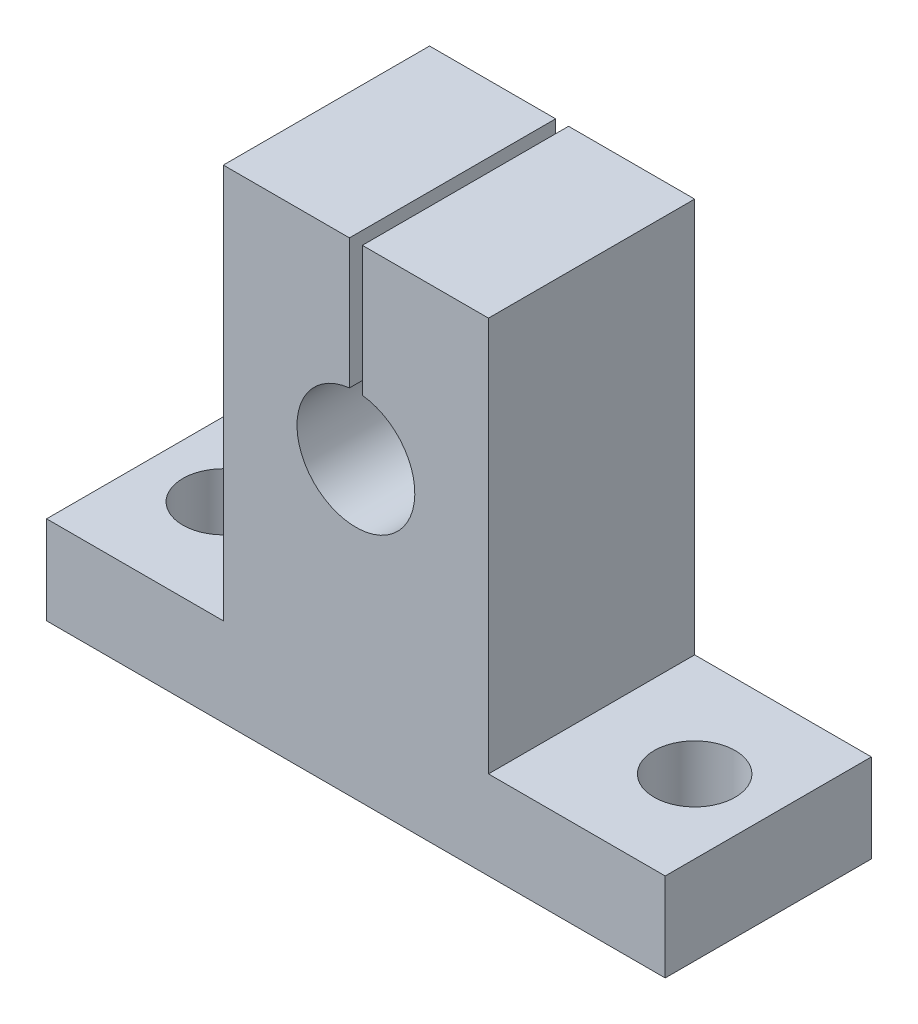
ISO-10303-21;
HEADER;
FILE_DESCRIPTION(('STEP AP214'),'2;1');
FILE_NAME('part.step','',(''),(''),'','','');
FILE_SCHEMA(('AUTOMOTIVE_DESIGN { 1 0 10303 214 1 1 1 1 }'));
ENDSEC;
DATA;
#1=APPLICATION_CONTEXT('core data for automotive mechanical design processes');
#2=APPLICATION_PROTOCOL_DEFINITION('international standard','automotive_design',2000,#1);
#3=PRODUCT_CONTEXT('',#1,'mechanical');
#4=PRODUCT('Part','Part','',(#3));
#5=PRODUCT_RELATED_PRODUCT_CATEGORY('part','',(#4));
#6=PRODUCT_DEFINITION_FORMATION('','',#4);
#7=PRODUCT_DEFINITION_CONTEXT('part definition',#1,'design');
#8=PRODUCT_DEFINITION('design','',#6,#7);
#9=PRODUCT_DEFINITION_SHAPE('','',#8);
#10=(LENGTH_UNIT() NAMED_UNIT(*) SI_UNIT(.MILLI.,.METRE.));
#11=(NAMED_UNIT(*) PLANE_ANGLE_UNIT() SI_UNIT($,.RADIAN.));
#12=(NAMED_UNIT(*) SI_UNIT($,.STERADIAN.) SOLID_ANGLE_UNIT());
#13=UNCERTAINTY_MEASURE_WITH_UNIT(LENGTH_MEASURE(1.E-05),#10,'distance_accuracy_value','');
#14=(GEOMETRIC_REPRESENTATION_CONTEXT(3) GLOBAL_UNCERTAINTY_ASSIGNED_CONTEXT((#13)) GLOBAL_UNIT_ASSIGNED_CONTEXT((#10,
#11,#12)) REPRESENTATION_CONTEXT('',''));
#15=CARTESIAN_POINT('',(0.,0.,0.));
#16=DIRECTION('',(0.,0.,1.));
#17=DIRECTION('',(1.,0.,0.));
#18=AXIS2_PLACEMENT_3D('',#15,#16,#17);
#19=CARTESIAN_POINT('',(21.,-14.,14.));
#20=DIRECTION('',(0.,-1.,0.));
#21=DIRECTION('',(1.,0.,0.));
#22=AXIS2_PLACEMENT_3D('',#19,#20,#21);
#23=PLANE('',#22);
#24=CARTESIAN_POINT('',(16.,-14.,7.));
#25=DIRECTION('',(0.,1.,0.));
#26=DIRECTION('',(0.,0.,1.));
#27=AXIS2_PLACEMENT_3D('',#24,#25,#26);
#28=CIRCLE('',#27,2.75);
#29=CARTESIAN_POINT('',(16.,-14.,9.75));
#30=VERTEX_POINT('',#29);
#31=EDGE_CURVE('E265',#30,#30,#28,.T.);
#32=ORIENTED_EDGE('',*,*,#31,.F.);
#33=EDGE_LOOP('',(#32));
#34=FACE_BOUND('',#33,.T.);
#35=DIRECTION('',(-1.,0.,0.));
#36=VECTOR('',#35,1.);
#37=CARTESIAN_POINT('',(21.,-14.,0.));
#38=LINE('',#37,#36);
#39=CARTESIAN_POINT('',(21.,-14.,0.));
#40=VERTEX_POINT('',#39);
#41=CARTESIAN_POINT('',(8.99999999999996,-14.,0.));
#42=VERTEX_POINT('',#41);
#43=EDGE_CURVE('E156',#40,#42,#38,.T.);
#44=ORIENTED_EDGE('',*,*,#43,.T.);
#45=DIRECTION('',(0.,0.,-1.));
#46=VECTOR('',#45,1.);
#47=CARTESIAN_POINT('',(8.99999999999996,-14.,14.));
#48=LINE('',#47,#46);
#49=CARTESIAN_POINT('',(8.99999999999996,-14.,14.));
#50=VERTEX_POINT('',#49);
#51=EDGE_CURVE('E11',#50,#42,#48,.T.);
#52=ORIENTED_EDGE('',*,*,#51,.F.);
#53=DIRECTION('',(-1.,0.,0.));
#54=VECTOR('',#53,1.);
#55=CARTESIAN_POINT('',(21.,-14.,14.));
#56=LINE('',#55,#54);
#57=CARTESIAN_POINT('',(21.,-14.,14.));
#58=VERTEX_POINT('',#57);
#59=EDGE_CURVE('E179',#58,#50,#56,.T.);
#60=ORIENTED_EDGE('',*,*,#59,.F.);
#61=DIRECTION('',(0.,0.,-1.));
#62=VECTOR('',#61,1.);
#63=CARTESIAN_POINT('',(21.,-14.,14.));
#64=LINE('',#63,#62);
#65=EDGE_CURVE('E152',#58,#40,#64,.T.);
#66=ORIENTED_EDGE('',*,*,#65,.T.);
#67=EDGE_LOOP('',(#44,#52,#60,#66));
#68=FACE_BOUND('',#67,.T.);
#69=ADVANCED_FACE('F36',(#34,#68),#23,.F.);
#70=CARTESIAN_POINT('',(8.99999999999996,-14.,14.));
#71=DIRECTION('',(-1.,0.,0.));
#72=DIRECTION('',(0.,-1.,0.));
#73=AXIS2_PLACEMENT_3D('',#70,#71,#72);
#74=PLANE('',#73);
#75=DIRECTION('',(0.,1.,0.));
#76=VECTOR('',#75,1.);
#77=CARTESIAN_POINT('',(8.99999999999996,-14.,0.));
#78=LINE('',#77,#76);
#79=CARTESIAN_POINT('',(9.,12.8,0.));
#80=VERTEX_POINT('',#79);
#81=EDGE_CURVE('E159',#42,#80,#78,.T.);
#82=ORIENTED_EDGE('',*,*,#81,.T.);
#83=DIRECTION('',(0.,0.,-1.));
#84=VECTOR('',#83,1.);
#85=CARTESIAN_POINT('',(9.,12.8,14.));
#86=LINE('',#85,#84);
#87=CARTESIAN_POINT('',(9.,12.8,14.));
#88=VERTEX_POINT('',#87);
#89=EDGE_CURVE('E44',#88,#80,#86,.T.);
#90=ORIENTED_EDGE('',*,*,#89,.F.);
#91=DIRECTION('',(0.,1.,0.));
#92=VECTOR('',#91,1.);
#93=CARTESIAN_POINT('',(8.99999999999996,-14.,14.));
#94=LINE('',#93,#92);
#95=EDGE_CURVE('E107',#50,#88,#94,.T.);
#96=ORIENTED_EDGE('',*,*,#95,.F.);
#97=ORIENTED_EDGE('',*,*,#51,.T.);
#98=EDGE_LOOP('',(#82,#90,#96,#97));
#99=FACE_BOUND('',#98,.T.);
#100=ADVANCED_FACE('F258',(#99),#74,.F.);
#101=CARTESIAN_POINT('',(0.438791816963508,12.8,14.));
#102=DIRECTION('',(0.,-1.,0.));
#103=DIRECTION('',(1.,0.,0.));
#104=AXIS2_PLACEMENT_3D('',#101,#102,#103);
#105=PLANE('',#104);
#106=DIRECTION('',(-1.,0.,0.));
#107=VECTOR('',#106,1.);
#108=CARTESIAN_POINT('',(0.438791816963508,12.8,0.));
#109=LINE('',#108,#107);
#110=CARTESIAN_POINT('',(0.438791816963508,12.8,0.));
#111=VERTEX_POINT('',#110);
#112=EDGE_CURVE('E162',#80,#111,#109,.T.);
#113=ORIENTED_EDGE('',*,*,#112,.T.);
#114=DIRECTION('',(0.,0.,-1.));
#115=VECTOR('',#114,1.);
#116=CARTESIAN_POINT('',(0.438791816963508,12.8,14.));
#117=LINE('',#116,#115);
#118=CARTESIAN_POINT('',(0.438791816963508,12.8,14.));
#119=VERTEX_POINT('',#118);
#120=EDGE_CURVE('E198',#119,#111,#117,.T.);
#121=ORIENTED_EDGE('',*,*,#120,.F.);
#122=DIRECTION('',(-1.,0.,0.));
#123=VECTOR('',#122,1.);
#124=CARTESIAN_POINT('',(0.438791816963508,12.8,14.));
#125=LINE('',#124,#123);
#126=EDGE_CURVE('E206',#88,#119,#125,.T.);
#127=ORIENTED_EDGE('',*,*,#126,.F.);
#128=ORIENTED_EDGE('',*,*,#89,.T.);
#129=EDGE_LOOP('',(#113,#121,#127,#128));
#130=FACE_BOUND('',#129,.T.);
#131=ADVANCED_FACE('F204',(#130),#105,.F.);
#132=CARTESIAN_POINT('',(0.438791816963508,12.8,14.));
#133=DIRECTION('',(1.,0.,0.));
#134=DIRECTION('',(0.,0.,-1.));
#135=AXIS2_PLACEMENT_3D('',#132,#133,#134);
#136=PLANE('',#135);
#137=DIRECTION('',(0.,-1.,0.));
#138=VECTOR('',#137,1.);
#139=CARTESIAN_POINT('',(0.438791816963508,12.8,0.));
#140=LINE('',#139,#138);
#141=CARTESIAN_POINT('',(0.438791816963509,3.97585987446312,0.));
#142=VERTEX_POINT('',#141);
#143=EDGE_CURVE('E164',#111,#142,#140,.T.);
#144=ORIENTED_EDGE('',*,*,#143,.T.);
#145=DIRECTION('',(0.,0.,-1.));
#146=VECTOR('',#145,1.);
#147=CARTESIAN_POINT('',(0.438791816963509,3.97585987446312,14.));
#148=LINE('',#147,#146);
#149=CARTESIAN_POINT('',(0.438791816963509,3.97585987446312,14.));
#150=VERTEX_POINT('',#149);
#151=EDGE_CURVE('E195',#150,#142,#148,.T.);
#152=ORIENTED_EDGE('',*,*,#151,.F.);
#153=DIRECTION('',(0.,-1.,0.));
#154=VECTOR('',#153,1.);
#155=CARTESIAN_POINT('',(0.438791816963508,12.8,14.));
#156=LINE('',#155,#154);
#157=EDGE_CURVE('E224',#119,#150,#156,.T.);
#158=ORIENTED_EDGE('',*,*,#157,.F.);
#159=ORIENTED_EDGE('',*,*,#120,.T.);
#160=EDGE_LOOP('',(#144,#152,#158,#159));
#161=FACE_BOUND('',#160,.T.);
#162=ADVANCED_FACE('F215',(#161),#136,.F.);
#163=CARTESIAN_POINT('',(0.,0.,14.));
#164=DIRECTION('',(0.,0.,-1.));
#165=DIRECTION('',(-1.,0.,0.));
#166=AXIS2_PLACEMENT_3D('',#163,#164,#165);
#167=CYLINDRICAL_SURFACE('',#166,4.);
#168=CARTESIAN_POINT('',(0.,0.,0.));
#169=DIRECTION('',(0.,0.,-1.));
#170=DIRECTION('',(1.,0.,0.));
#171=AXIS2_PLACEMENT_3D('',#168,#169,#170);
#172=CIRCLE('',#171,4.);
#173=CARTESIAN_POINT('',(-0.438791816963511,3.97585987446311,0.));
#174=VERTEX_POINT('',#173);
#175=EDGE_CURVE('E166',#142,#174,#172,.T.);
#176=ORIENTED_EDGE('',*,*,#175,.T.);
#177=DIRECTION('',(0.,0.,-1.));
#178=VECTOR('',#177,1.);
#179=CARTESIAN_POINT('',(-0.438791816963511,3.97585987446311,14.));
#180=LINE('',#179,#178);
#181=CARTESIAN_POINT('',(-0.438791816963511,3.97585987446311,14.));
#182=VERTEX_POINT('',#181);
#183=EDGE_CURVE('E192',#182,#174,#180,.T.);
#184=ORIENTED_EDGE('',*,*,#183,.F.);
#185=CARTESIAN_POINT('',(0.,0.,14.));
#186=DIRECTION('',(0.,0.,-1.));
#187=DIRECTION('',(1.,0.,0.));
#188=AXIS2_PLACEMENT_3D('',#185,#186,#187);
#189=CIRCLE('',#188,4.);
#190=EDGE_CURVE('E221',#150,#182,#189,.T.);
#191=ORIENTED_EDGE('',*,*,#190,.F.);
#192=ORIENTED_EDGE('',*,*,#151,.T.);
#193=EDGE_LOOP('',(#176,#184,#191,#192));
#194=FACE_BOUND('',#193,.T.);
#195=ADVANCED_FACE('F219',(#194),#167,.F.);
#196=CARTESIAN_POINT('',(-0.438791816963512,12.8,14.));
#197=DIRECTION('',(-1.,0.,0.));
#198=DIRECTION('',(0.,-1.,0.));
#199=AXIS2_PLACEMENT_3D('',#196,#197,#198);
#200=PLANE('',#199);
#201=DIRECTION('',(0.,1.,0.));
#202=VECTOR('',#201,1.);
#203=CARTESIAN_POINT('',(-0.438791816963512,12.8,0.));
#204=LINE('',#203,#202);
#205=CARTESIAN_POINT('',(-0.438791816963512,12.8,0.));
#206=VERTEX_POINT('',#205);
#207=EDGE_CURVE('E168',#174,#206,#204,.T.);
#208=ORIENTED_EDGE('',*,*,#207,.T.);
#209=DIRECTION('',(0.,0.,-1.));
#210=VECTOR('',#209,1.);
#211=CARTESIAN_POINT('',(-0.438791816963512,12.8,14.));
#212=LINE('',#211,#210);
#213=CARTESIAN_POINT('',(-0.438791816963512,12.8,14.));
#214=VERTEX_POINT('',#213);
#215=EDGE_CURVE('E189',#214,#206,#212,.T.);
#216=ORIENTED_EDGE('',*,*,#215,.F.);
#217=DIRECTION('',(0.,1.,0.));
#218=VECTOR('',#217,1.);
#219=CARTESIAN_POINT('',(-0.438791816963512,12.8,14.));
#220=LINE('',#219,#218);
#221=EDGE_CURVE('E223',#182,#214,#220,.T.);
#222=ORIENTED_EDGE('',*,*,#221,.F.);
#223=ORIENTED_EDGE('',*,*,#183,.T.);
#224=EDGE_LOOP('',(#208,#216,#222,#223));
#225=FACE_BOUND('',#224,.T.);
#226=ADVANCED_FACE('F300',(#225),#200,.F.);
#227=CARTESIAN_POINT('',(-9.,12.8,14.));
#228=DIRECTION('',(0.,-1.,0.));
#229=DIRECTION('',(1.,0.,0.));
#230=AXIS2_PLACEMENT_3D('',#227,#228,#229);
#231=PLANE('',#230);
#232=DIRECTION('',(-1.,0.,0.));
#233=VECTOR('',#232,1.);
#234=CARTESIAN_POINT('',(-9.,12.8,0.));
#235=LINE('',#234,#233);
#236=CARTESIAN_POINT('',(-9.,12.8,0.));
#237=VERTEX_POINT('',#236);
#238=EDGE_CURVE('E170',#206,#237,#235,.T.);
#239=ORIENTED_EDGE('',*,*,#238,.T.);
#240=DIRECTION('',(0.,0.,-1.));
#241=VECTOR('',#240,1.);
#242=CARTESIAN_POINT('',(-9.,12.8,14.));
#243=LINE('',#242,#241);
#244=CARTESIAN_POINT('',(-9.,12.8,14.));
#245=VERTEX_POINT('',#244);
#246=EDGE_CURVE('E186',#245,#237,#243,.T.);
#247=ORIENTED_EDGE('',*,*,#246,.F.);
#248=DIRECTION('',(-1.,0.,0.));
#249=VECTOR('',#248,1.);
#250=CARTESIAN_POINT('',(-9.,12.8,14.));
#251=LINE('',#250,#249);
#252=EDGE_CURVE('E226',#214,#245,#251,.T.);
#253=ORIENTED_EDGE('',*,*,#252,.F.);
#254=ORIENTED_EDGE('',*,*,#215,.T.);
#255=EDGE_LOOP('',(#239,#247,#253,#254));
#256=FACE_BOUND('',#255,.T.);
#257=ADVANCED_FACE('F295',(#256),#231,.F.);
#258=CARTESIAN_POINT('',(-9.,-14.,14.));
#259=DIRECTION('',(1.,0.,0.));
#260=DIRECTION('',(0.,0.,-1.));
#261=AXIS2_PLACEMENT_3D('',#258,#259,#260);
#262=PLANE('',#261);
#263=DIRECTION('',(0.,-1.,0.));
#264=VECTOR('',#263,1.);
#265=CARTESIAN_POINT('',(-9.,-14.,0.));
#266=LINE('',#265,#264);
#267=CARTESIAN_POINT('',(-9.,-14.,0.));
#268=VERTEX_POINT('',#267);
#269=EDGE_CURVE('E172',#237,#268,#266,.T.);
#270=ORIENTED_EDGE('',*,*,#269,.T.);
#271=DIRECTION('',(0.,0.,-1.));
#272=VECTOR('',#271,1.);
#273=CARTESIAN_POINT('',(-9.,-14.,14.));
#274=LINE('',#273,#272);
#275=CARTESIAN_POINT('',(-9.,-14.,14.));
#276=VERTEX_POINT('',#275);
#277=EDGE_CURVE('E183',#276,#268,#274,.T.);
#278=ORIENTED_EDGE('',*,*,#277,.F.);
#279=DIRECTION('',(0.,-1.,0.));
#280=VECTOR('',#279,1.);
#281=CARTESIAN_POINT('',(-9.,-14.,14.));
#282=LINE('',#281,#280);
#283=EDGE_CURVE('E232',#245,#276,#282,.T.);
#284=ORIENTED_EDGE('',*,*,#283,.F.);
#285=ORIENTED_EDGE('',*,*,#246,.T.);
#286=EDGE_LOOP('',(#270,#278,#284,#285));
#287=FACE_BOUND('',#286,.T.);
#288=ADVANCED_FACE('F238',(#287),#262,.F.);
#289=CARTESIAN_POINT('',(-21.,-14.,14.));
#290=DIRECTION('',(0.,-1.,0.));
#291=DIRECTION('',(0.,0.,-1.));
#292=AXIS2_PLACEMENT_3D('',#289,#290,#291);
#293=PLANE('',#292);
#294=CARTESIAN_POINT('',(-16.,-14.,7.));
#295=DIRECTION('',(0.,1.,0.));
#296=DIRECTION('',(0.,0.,1.));
#297=AXIS2_PLACEMENT_3D('',#294,#295,#296);
#298=CIRCLE('',#297,2.75);
#299=CARTESIAN_POINT('',(-16.,-14.,9.75));
#300=VERTEX_POINT('',#299);
#301=EDGE_CURVE('E270',#300,#300,#298,.T.);
#302=ORIENTED_EDGE('',*,*,#301,.F.);
#303=EDGE_LOOP('',(#302));
#304=FACE_BOUND('',#303,.T.);
#305=DIRECTION('',(-1.,0.,0.));
#306=VECTOR('',#305,1.);
#307=CARTESIAN_POINT('',(-21.,-14.,0.));
#308=LINE('',#307,#306);
#309=CARTESIAN_POINT('',(-21.,-14.,0.));
#310=VERTEX_POINT('',#309);
#311=EDGE_CURVE('E174',#268,#310,#308,.T.);
#312=ORIENTED_EDGE('',*,*,#311,.T.);
#313=DIRECTION('',(0.,0.,-1.));
#314=VECTOR('',#313,1.);
#315=CARTESIAN_POINT('',(-21.,-14.,14.));
#316=LINE('',#315,#314);
#317=CARTESIAN_POINT('',(-21.,-14.,14.));
#318=VERTEX_POINT('',#317);
#319=EDGE_CURVE('E147',#318,#310,#316,.T.);
#320=ORIENTED_EDGE('',*,*,#319,.F.);
#321=DIRECTION('',(-1.,0.,0.));
#322=VECTOR('',#321,1.);
#323=CARTESIAN_POINT('',(-21.,-14.,14.));
#324=LINE('',#323,#322);
#325=EDGE_CURVE('E138',#276,#318,#324,.T.);
#326=ORIENTED_EDGE('',*,*,#325,.F.);
#327=ORIENTED_EDGE('',*,*,#277,.T.);
#328=EDGE_LOOP('',(#312,#320,#326,#327));
#329=FACE_BOUND('',#328,.T.);
#330=ADVANCED_FACE('F242',(#304,#329),#293,.F.);
#331=CARTESIAN_POINT('',(-21.,-20.,14.));
#332=DIRECTION('',(1.,0.,0.));
#333=DIRECTION('',(0.,0.,-1.));
#334=AXIS2_PLACEMENT_3D('',#331,#332,#333);
#335=PLANE('',#334);
#336=DIRECTION('',(0.,-1.,0.));
#337=VECTOR('',#336,1.);
#338=CARTESIAN_POINT('',(-21.,-20.,0.));
#339=LINE('',#338,#337);
#340=CARTESIAN_POINT('',(-21.,-20.,0.));
#341=VERTEX_POINT('',#340);
#342=EDGE_CURVE('E146',#310,#341,#339,.T.);
#343=ORIENTED_EDGE('',*,*,#342,.T.);
#344=DIRECTION('',(0.,0.,-1.));
#345=VECTOR('',#344,1.);
#346=CARTESIAN_POINT('',(-21.,-20.,14.));
#347=LINE('',#346,#345);
#348=CARTESIAN_POINT('',(-21.,-20.,14.));
#349=VERTEX_POINT('',#348);
#350=EDGE_CURVE('E143',#349,#341,#347,.T.);
#351=ORIENTED_EDGE('',*,*,#350,.F.);
#352=DIRECTION('',(0.,-1.,0.));
#353=VECTOR('',#352,1.);
#354=CARTESIAN_POINT('',(-21.,-20.,14.));
#355=LINE('',#354,#353);
#356=EDGE_CURVE('E132',#318,#349,#355,.T.);
#357=ORIENTED_EDGE('',*,*,#356,.F.);
#358=ORIENTED_EDGE('',*,*,#319,.T.);
#359=EDGE_LOOP('',(#343,#351,#357,#358));
#360=FACE_BOUND('',#359,.T.);
#361=ADVANCED_FACE('F144',(#360),#335,.F.);
#362=CARTESIAN_POINT('',(21.,-20.,14.));
#363=DIRECTION('',(0.,1.,0.));
#364=DIRECTION('',(-1.,0.,0.));
#365=AXIS2_PLACEMENT_3D('',#362,#363,#364);
#366=PLANE('',#365);
#367=CARTESIAN_POINT('',(-16.,-20.,7.));
#368=DIRECTION('',(0.,1.,0.));
#369=DIRECTION('',(0.,0.,1.));
#370=AXIS2_PLACEMENT_3D('',#367,#368,#369);
#371=CIRCLE('',#370,2.75);
#372=CARTESIAN_POINT('',(-16.,-20.,9.75));
#373=VERTEX_POINT('',#372);
#374=EDGE_CURVE('E160',#373,#373,#371,.T.);
#375=ORIENTED_EDGE('',*,*,#374,.T.);
#376=EDGE_LOOP('',(#375));
#377=FACE_BOUND('',#376,.T.);
#378=CARTESIAN_POINT('',(16.,-20.,7.));
#379=DIRECTION('',(0.,1.,0.));
#380=DIRECTION('',(0.,0.,1.));
#381=AXIS2_PLACEMENT_3D('',#378,#379,#380);
#382=CIRCLE('',#381,2.75);
#383=CARTESIAN_POINT('',(16.,-20.,9.75));
#384=VERTEX_POINT('',#383);
#385=EDGE_CURVE('E267',#384,#384,#382,.T.);
#386=ORIENTED_EDGE('',*,*,#385,.T.);
#387=EDGE_LOOP('',(#386));
#388=FACE_BOUND('',#387,.T.);
#389=DIRECTION('',(1.,0.,0.));
#390=VECTOR('',#389,1.);
#391=CARTESIAN_POINT('',(21.,-20.,0.));
#392=LINE('',#391,#390);
#393=CARTESIAN_POINT('',(21.,-20.,0.));
#394=VERTEX_POINT('',#393);
#395=EDGE_CURVE('E93',#341,#394,#392,.T.);
#396=ORIENTED_EDGE('',*,*,#395,.T.);
#397=DIRECTION('',(0.,0.,-1.));
#398=VECTOR('',#397,1.);
#399=CARTESIAN_POINT('',(21.,-20.,14.));
#400=LINE('',#399,#398);
#401=CARTESIAN_POINT('',(21.,-20.,14.));
#402=VERTEX_POINT('',#401);
#403=EDGE_CURVE('E148',#402,#394,#400,.T.);
#404=ORIENTED_EDGE('',*,*,#403,.F.);
#405=DIRECTION('',(1.,0.,0.));
#406=VECTOR('',#405,1.);
#407=CARTESIAN_POINT('',(21.,-20.,14.));
#408=LINE('',#407,#406);
#409=EDGE_CURVE('E136',#349,#402,#408,.T.);
#410=ORIENTED_EDGE('',*,*,#409,.F.);
#411=ORIENTED_EDGE('',*,*,#350,.T.);
#412=EDGE_LOOP('',(#396,#404,#410,#411));
#413=FACE_BOUND('',#412,.T.);
#414=ADVANCED_FACE('F150',(#377,#388,#413),#366,.F.);
#415=CARTESIAN_POINT('',(21.,-20.,14.));
#416=DIRECTION('',(-1.,0.,0.));
#417=DIRECTION('',(0.,-1.,0.));
#418=AXIS2_PLACEMENT_3D('',#415,#416,#417);
#419=PLANE('',#418);
#420=DIRECTION('',(0.,1.,0.));
#421=VECTOR('',#420,1.);
#422=CARTESIAN_POINT('',(21.,-20.,0.));
#423=LINE('',#422,#421);
#424=EDGE_CURVE('E99',#394,#40,#423,.T.);
#425=ORIENTED_EDGE('',*,*,#424,.T.);
#426=ORIENTED_EDGE('',*,*,#65,.F.);
#427=DIRECTION('',(0.,1.,0.));
#428=VECTOR('',#427,1.);
#429=CARTESIAN_POINT('',(21.,-20.,14.));
#430=LINE('',#429,#428);
#431=EDGE_CURVE('E52',#402,#58,#430,.T.);
#432=ORIENTED_EDGE('',*,*,#431,.F.);
#433=ORIENTED_EDGE('',*,*,#403,.T.);
#434=EDGE_LOOP('',(#425,#426,#432,#433));
#435=FACE_BOUND('',#434,.T.);
#436=ADVANCED_FACE('F246',(#435),#419,.F.);
#437=CARTESIAN_POINT('',(0.,0.,14.));
#438=DIRECTION('',(0.,0.,1.));
#439=DIRECTION('',(1.,0.,0.));
#440=AXIS2_PLACEMENT_3D('',#437,#438,#439);
#441=PLANE('',#440);
#442=ORIENTED_EDGE('',*,*,#59,.T.);
#443=ORIENTED_EDGE('',*,*,#95,.T.);
#444=ORIENTED_EDGE('',*,*,#126,.T.);
#445=ORIENTED_EDGE('',*,*,#157,.T.);
#446=ORIENTED_EDGE('',*,*,#190,.T.);
#447=ORIENTED_EDGE('',*,*,#221,.T.);
#448=ORIENTED_EDGE('',*,*,#252,.T.);
#449=ORIENTED_EDGE('',*,*,#283,.T.);
#450=ORIENTED_EDGE('',*,*,#325,.T.);
#451=ORIENTED_EDGE('',*,*,#356,.T.);
#452=ORIENTED_EDGE('',*,*,#409,.T.);
#453=ORIENTED_EDGE('',*,*,#431,.T.);
#454=EDGE_LOOP('',(#442,#443,#444,#445,#446,#447,#448,#449,#450,#451,#452,#453));
#455=FACE_BOUND('',#454,.T.);
#456=ADVANCED_FACE('F134',(#455),#441,.T.);
#457=CARTESIAN_POINT('',(0.,0.,0.));
#458=DIRECTION('',(0.,0.,1.));
#459=DIRECTION('',(1.,0.,0.));
#460=AXIS2_PLACEMENT_3D('',#457,#458,#459);
#461=PLANE('',#460);
#462=ORIENTED_EDGE('',*,*,#43,.F.);
#463=ORIENTED_EDGE('',*,*,#424,.F.);
#464=ORIENTED_EDGE('',*,*,#395,.F.);
#465=ORIENTED_EDGE('',*,*,#342,.F.);
#466=ORIENTED_EDGE('',*,*,#311,.F.);
#467=ORIENTED_EDGE('',*,*,#269,.F.);
#468=ORIENTED_EDGE('',*,*,#238,.F.);
#469=ORIENTED_EDGE('',*,*,#207,.F.);
#470=ORIENTED_EDGE('',*,*,#175,.F.);
#471=ORIENTED_EDGE('',*,*,#143,.F.);
#472=ORIENTED_EDGE('',*,*,#112,.F.);
#473=ORIENTED_EDGE('',*,*,#81,.F.);
#474=EDGE_LOOP('',(#462,#463,#464,#465,#466,#467,#468,#469,#470,#471,#472,#473));
#475=FACE_BOUND('',#474,.T.);
#476=ADVANCED_FACE('F210',(#475),#461,.F.);
#477=CARTESIAN_POINT('',(16.,-20.,7.));
#478=DIRECTION('',(0.,1.,0.));
#479=DIRECTION('',(0.,0.,1.));
#480=AXIS2_PLACEMENT_3D('',#477,#478,#479);
#481=CYLINDRICAL_SURFACE('',#480,2.75);
#482=ORIENTED_EDGE('',*,*,#385,.F.);
#483=EDGE_LOOP('',(#482));
#484=FACE_BOUND('',#483,.T.);
#485=ORIENTED_EDGE('',*,*,#31,.T.);
#486=EDGE_LOOP('',(#485));
#487=FACE_BOUND('',#486,.T.);
#488=ADVANCED_FACE('F284',(#484,#487),#481,.F.);
#489=CARTESIAN_POINT('',(-16.,-20.,7.));
#490=DIRECTION('',(0.,1.,0.));
#491=DIRECTION('',(0.,0.,1.));
#492=AXIS2_PLACEMENT_3D('',#489,#490,#491);
#493=CYLINDRICAL_SURFACE('',#492,2.75);
#494=ORIENTED_EDGE('',*,*,#374,.F.);
#495=EDGE_LOOP('',(#494));
#496=FACE_BOUND('',#495,.T.);
#497=ORIENTED_EDGE('',*,*,#301,.T.);
#498=EDGE_LOOP('',(#497));
#499=FACE_BOUND('',#498,.T.);
#500=ADVANCED_FACE('F281',(#496,#499),#493,.F.);
#501=CLOSED_SHELL('',(#69,#100,#131,#162,#195,#226,#257,#288,#330,#361,#414,#436,#456,#476,#488,#500));
#502=MANIFOLD_SOLID_BREP('B2',#501);
#503=ADVANCED_BREP_SHAPE_REPRESENTATION('',(#18,#502),#14);
#504=SHAPE_DEFINITION_REPRESENTATION(#9,#503);
ENDSEC;
END-ISO-10303-21;
